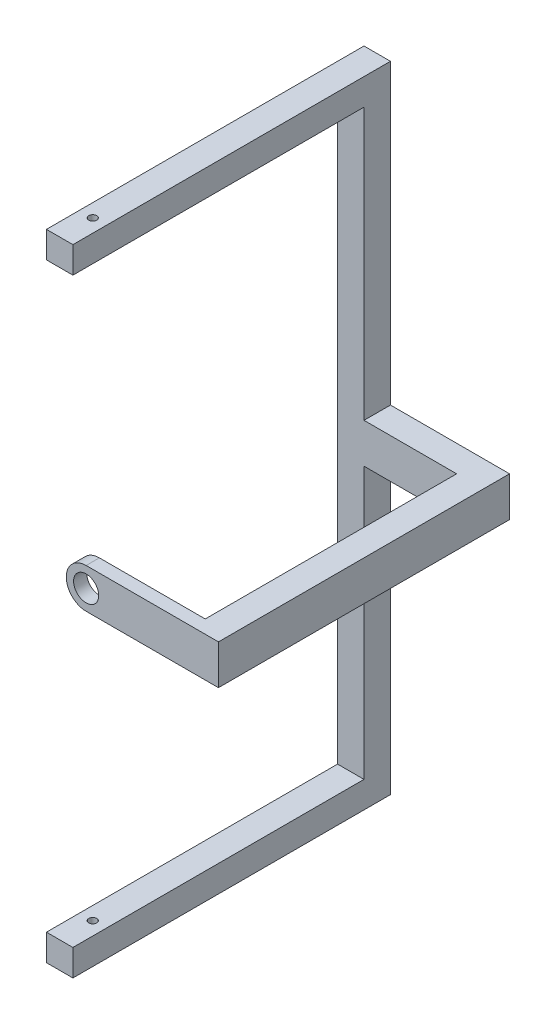
ISO-10303-21;
HEADER;
FILE_DESCRIPTION(('STEP AP214'),'2;1');
FILE_NAME('part.step','',(''),(''),'','','');
FILE_SCHEMA(('AUTOMOTIVE_DESIGN { 1 0 10303 214 1 1 1 1 }'));
ENDSEC;
DATA;
#1=APPLICATION_CONTEXT('core data for automotive mechanical design processes');
#2=APPLICATION_PROTOCOL_DEFINITION('international standard','automotive_design',2000,#1);
#3=PRODUCT_CONTEXT('',#1,'mechanical');
#4=PRODUCT('Part','Part','',(#3));
#5=PRODUCT_RELATED_PRODUCT_CATEGORY('part','',(#4));
#6=PRODUCT_DEFINITION_FORMATION('','',#4);
#7=PRODUCT_DEFINITION_CONTEXT('part definition',#1,'design');
#8=PRODUCT_DEFINITION('design','',#6,#7);
#9=PRODUCT_DEFINITION_SHAPE('','',#8);
#10=(LENGTH_UNIT() NAMED_UNIT(*) SI_UNIT(.MILLI.,.METRE.));
#11=(NAMED_UNIT(*) PLANE_ANGLE_UNIT() SI_UNIT($,.RADIAN.));
#12=(NAMED_UNIT(*) SI_UNIT($,.STERADIAN.) SOLID_ANGLE_UNIT());
#13=UNCERTAINTY_MEASURE_WITH_UNIT(LENGTH_MEASURE(1.E-05),#10,'distance_accuracy_value','');
#14=(GEOMETRIC_REPRESENTATION_CONTEXT(3) GLOBAL_UNCERTAINTY_ASSIGNED_CONTEXT((#13)) GLOBAL_UNIT_ASSIGNED_CONTEXT((#10,
#11,#12)) REPRESENTATION_CONTEXT('',''));
#15=CARTESIAN_POINT('',(0.,0.,0.));
#16=DIRECTION('',(0.,0.,1.));
#17=DIRECTION('',(1.,0.,0.));
#18=AXIS2_PLACEMENT_3D('',#15,#16,#17);
#19=CARTESIAN_POINT('',(80.,15.,-210.));
#20=DIRECTION('',(1.,0.,0.));
#21=DIRECTION('',(0.,0.,-1.));
#22=AXIS2_PLACEMENT_3D('',#19,#20,#21);
#23=PLANE('',#22);
#24=DIRECTION('',(0.,1.,0.));
#25=VECTOR('',#24,1.);
#26=CARTESIAN_POINT('',(80.,15.,-190.));
#27=LINE('',#26,#25);
#28=CARTESIAN_POINT('',(80.,-15.,-190.));
#29=VERTEX_POINT('',#28);
#30=CARTESIAN_POINT('',(80.,15.,-190.));
#31=VERTEX_POINT('',#30);
#32=EDGE_CURVE('E276',#29,#31,#27,.T.);
#33=ORIENTED_EDGE('',*,*,#32,.F.);
#34=DIRECTION('',(0.,0.,1.));
#35=VECTOR('',#34,1.);
#36=CARTESIAN_POINT('',(80.,-15.,-210.));
#37=LINE('',#36,#35);
#38=CARTESIAN_POINT('',(80.,-15.,0.));
#39=VERTEX_POINT('',#38);
#40=EDGE_CURVE('E61',#29,#39,#37,.T.);
#41=ORIENTED_EDGE('',*,*,#40,.T.);
#42=DIRECTION('',(0.,1.,0.));
#43=VECTOR('',#42,1.);
#44=CARTESIAN_POINT('',(80.,15.,0.));
#45=LINE('',#44,#43);
#46=CARTESIAN_POINT('',(80.,15.,0.));
#47=VERTEX_POINT('',#46);
#48=EDGE_CURVE('E293',#39,#47,#45,.T.);
#49=ORIENTED_EDGE('',*,*,#48,.T.);
#50=DIRECTION('',(0.,0.,1.));
#51=VECTOR('',#50,1.);
#52=CARTESIAN_POINT('',(80.,15.,-210.));
#53=LINE('',#52,#51);
#54=EDGE_CURVE('E305',#31,#47,#53,.T.);
#55=ORIENTED_EDGE('',*,*,#54,.F.);
#56=EDGE_LOOP('',(#33,#41,#49,#55));
#57=FACE_BOUND('',#56,.T.);
#58=ADVANCED_FACE('F45',(#57),#23,.F.);
#59=CARTESIAN_POINT('',(0.,0.,0.));
#60=DIRECTION('',(0.,0.,1.));
#61=DIRECTION('',(1.,0.,0.));
#62=AXIS2_PLACEMENT_3D('',#59,#60,#61);
#63=PLANE('',#62);
#64=CARTESIAN_POINT('',(0.,0.,0.));
#65=DIRECTION('',(0.,0.,1.));
#66=DIRECTION('',(1.,0.,0.));
#67=AXIS2_PLACEMENT_3D('',#64,#65,#66);
#68=CIRCLE('',#67,9.5);
#69=CARTESIAN_POINT('',(9.5,0.,0.));
#70=VERTEX_POINT('',#69);
#71=EDGE_CURVE('E312',#70,#70,#68,.T.);
#72=ORIENTED_EDGE('',*,*,#71,.T.);
#73=EDGE_LOOP('',(#72));
#74=FACE_BOUND('',#73,.T.);
#75=ORIENTED_EDGE('',*,*,#48,.F.);
#76=DIRECTION('',(1.,0.,0.));
#77=VECTOR('',#76,1.);
#78=CARTESIAN_POINT('',(100.,-15.,0.));
#79=LINE('',#78,#77);
#80=CARTESIAN_POINT('',(0.,-15.,0.));
#81=VERTEX_POINT('',#80);
#82=EDGE_CURVE('E335',#81,#39,#79,.T.);
#83=ORIENTED_EDGE('',*,*,#82,.F.);
#84=CARTESIAN_POINT('',(0.,0.,0.));
#85=DIRECTION('',(0.,0.,1.));
#86=DIRECTION('',(1.,0.,0.));
#87=AXIS2_PLACEMENT_3D('',#84,#85,#86);
#88=CIRCLE('',#87,15.);
#89=CARTESIAN_POINT('',(0.,15.,0.));
#90=VERTEX_POINT('',#89);
#91=EDGE_CURVE('E317',#90,#81,#88,.T.);
#92=ORIENTED_EDGE('',*,*,#91,.F.);
#93=DIRECTION('',(-1.,0.,0.));
#94=VECTOR('',#93,1.);
#95=CARTESIAN_POINT('',(0.,15.,0.));
#96=LINE('',#95,#94);
#97=EDGE_CURVE('E85',#47,#90,#96,.T.);
#98=ORIENTED_EDGE('',*,*,#97,.F.);
#99=EDGE_LOOP('',(#75,#83,#92,#98));
#100=FACE_BOUND('',#99,.T.);
#101=ADVANCED_FACE('F368',(#74,#100),#63,.F.);
#102=CARTESIAN_POINT('',(0.,0.,10.));
#103=DIRECTION('',(0.,0.,1.));
#104=DIRECTION('',(1.,0.,0.));
#105=AXIS2_PLACEMENT_3D('',#102,#103,#104);
#106=PLANE('',#105);
#107=CARTESIAN_POINT('',(0.,0.,10.));
#108=DIRECTION('',(0.,0.,1.));
#109=DIRECTION('',(1.,0.,0.));
#110=AXIS2_PLACEMENT_3D('',#107,#108,#109);
#111=CIRCLE('',#110,15.);
#112=CARTESIAN_POINT('',(0.,15.,10.));
#113=VERTEX_POINT('',#112);
#114=CARTESIAN_POINT('',(0.,-15.,10.));
#115=VERTEX_POINT('',#114);
#116=EDGE_CURVE('E321',#113,#115,#111,.T.);
#117=ORIENTED_EDGE('',*,*,#116,.T.);
#118=DIRECTION('',(1.,0.,0.));
#119=VECTOR('',#118,1.);
#120=CARTESIAN_POINT('',(100.,-15.,10.));
#121=LINE('',#120,#119);
#122=CARTESIAN_POINT('',(100.,-15.,10.));
#123=VERTEX_POINT('',#122);
#124=EDGE_CURVE('E92',#115,#123,#121,.T.);
#125=ORIENTED_EDGE('',*,*,#124,.T.);
#126=DIRECTION('',(0.,1.,0.));
#127=VECTOR('',#126,1.);
#128=CARTESIAN_POINT('',(100.,15.,10.));
#129=LINE('',#128,#127);
#130=CARTESIAN_POINT('',(100.,15.,10.));
#131=VERTEX_POINT('',#130);
#132=EDGE_CURVE('E326',#123,#131,#129,.T.);
#133=ORIENTED_EDGE('',*,*,#132,.T.);
#134=DIRECTION('',(-1.,0.,0.));
#135=VECTOR('',#134,1.);
#136=CARTESIAN_POINT('',(0.,15.,10.));
#137=LINE('',#136,#135);
#138=EDGE_CURVE('E70',#131,#113,#137,.T.);
#139=ORIENTED_EDGE('',*,*,#138,.T.);
#140=EDGE_LOOP('',(#117,#125,#133,#139));
#141=FACE_BOUND('',#140,.T.);
#142=CARTESIAN_POINT('',(0.,0.,10.));
#143=DIRECTION('',(0.,0.,1.));
#144=DIRECTION('',(1.,0.,0.));
#145=AXIS2_PLACEMENT_3D('',#142,#143,#144);
#146=CIRCLE('',#145,9.5);
#147=CARTESIAN_POINT('',(9.5,0.,10.));
#148=VERTEX_POINT('',#147);
#149=EDGE_CURVE('E313',#148,#148,#146,.T.);
#150=ORIENTED_EDGE('',*,*,#149,.F.);
#151=EDGE_LOOP('',(#150));
#152=FACE_BOUND('',#151,.T.);
#153=ADVANCED_FACE('F365',(#141,#152),#106,.T.);
#154=CARTESIAN_POINT('',(0.,0.,10.));
#155=DIRECTION('',(0.,0.,-1.));
#156=DIRECTION('',(-1.,0.,0.));
#157=AXIS2_PLACEMENT_3D('',#154,#155,#156);
#158=CYLINDRICAL_SURFACE('',#157,15.);
#159=ORIENTED_EDGE('',*,*,#91,.T.);
#160=DIRECTION('',(0.,0.,-1.));
#161=VECTOR('',#160,1.);
#162=CARTESIAN_POINT('',(0.,-15.,10.));
#163=LINE('',#162,#161);
#164=EDGE_CURVE('E11',#115,#81,#163,.T.);
#165=ORIENTED_EDGE('',*,*,#164,.F.);
#166=ORIENTED_EDGE('',*,*,#116,.F.);
#167=DIRECTION('',(0.,0.,-1.));
#168=VECTOR('',#167,1.);
#169=CARTESIAN_POINT('',(0.,15.,10.));
#170=LINE('',#169,#168);
#171=EDGE_CURVE('E331',#113,#90,#170,.T.);
#172=ORIENTED_EDGE('',*,*,#171,.T.);
#173=EDGE_LOOP('',(#159,#165,#166,#172));
#174=FACE_BOUND('',#173,.T.);
#175=ADVANCED_FACE('F47',(#174),#158,.T.);
#176=CARTESIAN_POINT('',(100.,-15.,10.));
#177=DIRECTION('',(0.,1.,0.));
#178=DIRECTION('',(-1.,0.,0.));
#179=AXIS2_PLACEMENT_3D('',#176,#177,#178);
#180=PLANE('',#179);
#181=ORIENTED_EDGE('',*,*,#82,.T.);
#182=ORIENTED_EDGE('',*,*,#40,.F.);
#183=DIRECTION('',(1.,0.,0.));
#184=VECTOR('',#183,1.);
#185=CARTESIAN_POINT('',(9.99999999999999,-15.,-190.));
#186=LINE('',#185,#184);
#187=CARTESIAN_POINT('',(9.99999999999999,-15.,-190.));
#188=VERTEX_POINT('',#187);
#189=EDGE_CURVE('E290',#188,#29,#186,.T.);
#190=ORIENTED_EDGE('',*,*,#189,.F.);
#191=DIRECTION('',(0.,0.,1.));
#192=VECTOR('',#191,1.);
#193=CARTESIAN_POINT('',(9.99999999999999,-15.,-210.));
#194=LINE('',#193,#192);
#195=CARTESIAN_POINT('',(9.99999999999999,-15.,-210.));
#196=VERTEX_POINT('',#195);
#197=EDGE_CURVE('E277',#196,#188,#194,.T.);
#198=ORIENTED_EDGE('',*,*,#197,.F.);
#199=DIRECTION('',(-1.,0.,0.));
#200=VECTOR('',#199,1.);
#201=CARTESIAN_POINT('',(100.,-15.,-210.));
#202=LINE('',#201,#200);
#203=CARTESIAN_POINT('',(100.,-15.,-210.));
#204=VERTEX_POINT('',#203);
#205=EDGE_CURVE('E298',#204,#196,#202,.T.);
#206=ORIENTED_EDGE('',*,*,#205,.F.);
#207=DIRECTION('',(0.,0.,-1.));
#208=VECTOR('',#207,1.);
#209=CARTESIAN_POINT('',(100.,-15.,10.));
#210=LINE('',#209,#208);
#211=EDGE_CURVE('E54',#123,#204,#210,.T.);
#212=ORIENTED_EDGE('',*,*,#211,.F.);
#213=ORIENTED_EDGE('',*,*,#124,.F.);
#214=ORIENTED_EDGE('',*,*,#164,.T.);
#215=EDGE_LOOP('',(#181,#182,#190,#198,#206,#212,#213,#214));
#216=FACE_BOUND('',#215,.T.);
#217=ADVANCED_FACE('F353',(#216),#180,.F.);
#218=CARTESIAN_POINT('',(100.,15.,10.));
#219=DIRECTION('',(-1.,0.,0.));
#220=DIRECTION('',(0.,0.,1.));
#221=AXIS2_PLACEMENT_3D('',#218,#219,#220);
#222=PLANE('',#221);
#223=ORIENTED_EDGE('',*,*,#211,.T.);
#224=DIRECTION('',(0.,-1.,0.));
#225=VECTOR('',#224,1.);
#226=CARTESIAN_POINT('',(100.,15.,-210.));
#227=LINE('',#226,#225);
#228=CARTESIAN_POINT('',(100.,15.,-210.));
#229=VERTEX_POINT('',#228);
#230=EDGE_CURVE('E294',#229,#204,#227,.T.);
#231=ORIENTED_EDGE('',*,*,#230,.F.);
#232=DIRECTION('',(0.,0.,-1.));
#233=VECTOR('',#232,1.);
#234=CARTESIAN_POINT('',(100.,15.,10.));
#235=LINE('',#234,#233);
#236=EDGE_CURVE('E343',#131,#229,#235,.T.);
#237=ORIENTED_EDGE('',*,*,#236,.F.);
#238=ORIENTED_EDGE('',*,*,#132,.F.);
#239=EDGE_LOOP('',(#223,#231,#237,#238));
#240=FACE_BOUND('',#239,.T.);
#241=ADVANCED_FACE('F350',(#240),#222,.F.);
#242=CARTESIAN_POINT('',(0.,15.,10.));
#243=DIRECTION('',(0.,-1.,0.));
#244=DIRECTION('',(1.,0.,0.));
#245=AXIS2_PLACEMENT_3D('',#242,#243,#244);
#246=PLANE('',#245);
#247=ORIENTED_EDGE('',*,*,#236,.T.);
#248=DIRECTION('',(1.,0.,0.));
#249=VECTOR('',#248,1.);
#250=CARTESIAN_POINT('',(100.,15.,-210.));
#251=LINE('',#250,#249);
#252=CARTESIAN_POINT('',(9.99999999999999,15.,-210.));
#253=VERTEX_POINT('',#252);
#254=EDGE_CURVE('E301',#253,#229,#251,.T.);
#255=ORIENTED_EDGE('',*,*,#254,.F.);
#256=DIRECTION('',(0.,0.,-1.));
#257=VECTOR('',#256,1.);
#258=CARTESIAN_POINT('',(9.99999999999999,15.,-210.));
#259=LINE('',#258,#257);
#260=CARTESIAN_POINT('',(9.99999999999999,15.,-190.));
#261=VERTEX_POINT('',#260);
#262=EDGE_CURVE('E281',#261,#253,#259,.T.);
#263=ORIENTED_EDGE('',*,*,#262,.F.);
#264=DIRECTION('',(1.,0.,0.));
#265=VECTOR('',#264,1.);
#266=CARTESIAN_POINT('',(9.99999999999999,15.,-190.));
#267=LINE('',#266,#265);
#268=EDGE_CURVE('E284',#261,#31,#267,.T.);
#269=ORIENTED_EDGE('',*,*,#268,.T.);
#270=ORIENTED_EDGE('',*,*,#54,.T.);
#271=ORIENTED_EDGE('',*,*,#97,.T.);
#272=ORIENTED_EDGE('',*,*,#171,.F.);
#273=ORIENTED_EDGE('',*,*,#138,.F.);
#274=EDGE_LOOP('',(#247,#255,#263,#269,#270,#271,#272,#273));
#275=FACE_BOUND('',#274,.T.);
#276=ADVANCED_FACE('F360',(#275),#246,.F.);
#277=CARTESIAN_POINT('',(0.,0.,10.));
#278=DIRECTION('',(0.,0.,-1.));
#279=DIRECTION('',(-1.,0.,0.));
#280=AXIS2_PLACEMENT_3D('',#277,#278,#279);
#281=CYLINDRICAL_SURFACE('',#280,9.5);
#282=ORIENTED_EDGE('',*,*,#149,.T.);
#283=EDGE_LOOP('',(#282));
#284=FACE_BOUND('',#283,.T.);
#285=ORIENTED_EDGE('',*,*,#71,.F.);
#286=EDGE_LOOP('',(#285));
#287=FACE_BOUND('',#286,.T.);
#288=ADVANCED_FACE('F372',(#284,#287),#281,.F.);
#289=CARTESIAN_POINT('',(0.,0.,-210.));
#290=DIRECTION('',(0.,0.,-1.));
#291=DIRECTION('',(-1.,0.,0.));
#292=AXIS2_PLACEMENT_3D('',#289,#290,#291);
#293=PLANE('',#292);
#294=ORIENTED_EDGE('',*,*,#230,.T.);
#295=ORIENTED_EDGE('',*,*,#205,.T.);
#296=DIRECTION('',(0.,-1.,0.));
#297=VECTOR('',#296,1.);
#298=CARTESIAN_POINT('',(9.99999999999999,-240.,-210.));
#299=LINE('',#298,#297);
#300=CARTESIAN_POINT('',(9.99999999999999,-240.,-210.));
#301=VERTEX_POINT('',#300);
#302=EDGE_CURVE('E193',#196,#301,#299,.T.);
#303=ORIENTED_EDGE('',*,*,#302,.T.);
#304=DIRECTION('',(1.,0.,0.));
#305=VECTOR('',#304,1.);
#306=CARTESIAN_POINT('',(-10.,-240.,-210.));
#307=LINE('',#306,#305);
#308=CARTESIAN_POINT('',(-10.,-240.,-210.));
#309=VERTEX_POINT('',#308);
#310=EDGE_CURVE('E272',#309,#301,#307,.T.);
#311=ORIENTED_EDGE('',*,*,#310,.F.);
#312=DIRECTION('',(0.,-1.,0.));
#313=VECTOR('',#312,1.);
#314=CARTESIAN_POINT('',(-10.,-240.,-210.));
#315=LINE('',#314,#313);
#316=CARTESIAN_POINT('',(-10.,240.,-210.));
#317=VERTEX_POINT('',#316);
#318=EDGE_CURVE('E236',#317,#309,#315,.T.);
#319=ORIENTED_EDGE('',*,*,#318,.F.);
#320=DIRECTION('',(1.,0.,0.));
#321=VECTOR('',#320,1.);
#322=CARTESIAN_POINT('',(-10.,240.,-210.));
#323=LINE('',#322,#321);
#324=CARTESIAN_POINT('',(9.99999999999999,240.,-210.));
#325=VERTEX_POINT('',#324);
#326=EDGE_CURVE('E214',#317,#325,#323,.T.);
#327=ORIENTED_EDGE('',*,*,#326,.T.);
#328=DIRECTION('',(0.,1.,0.));
#329=VECTOR('',#328,1.);
#330=CARTESIAN_POINT('',(9.99999999999999,240.,-210.));
#331=LINE('',#330,#329);
#332=EDGE_CURVE('E199',#253,#325,#331,.T.);
#333=ORIENTED_EDGE('',*,*,#332,.F.);
#334=ORIENTED_EDGE('',*,*,#254,.T.);
#335=EDGE_LOOP('',(#294,#295,#303,#311,#319,#327,#333,#334));
#336=FACE_BOUND('',#335,.T.);
#337=ADVANCED_FACE('F356',(#336),#293,.T.);
#338=CARTESIAN_POINT('',(9.99999999999999,15.,-190.));
#339=DIRECTION('',(0.,0.,-1.));
#340=DIRECTION('',(-1.,0.,0.));
#341=AXIS2_PLACEMENT_3D('',#338,#339,#340);
#342=PLANE('',#341);
#343=ORIENTED_EDGE('',*,*,#268,.F.);
#344=DIRECTION('',(0.,-1.,0.));
#345=VECTOR('',#344,1.);
#346=CARTESIAN_POINT('',(9.99999999999999,0.,-190.));
#347=LINE('',#346,#345);
#348=CARTESIAN_POINT('',(9.99999999999999,220.,-190.));
#349=VERTEX_POINT('',#348);
#350=EDGE_CURVE('E188',#349,#261,#347,.T.);
#351=ORIENTED_EDGE('',*,*,#350,.F.);
#352=DIRECTION('',(1.,0.,0.));
#353=VECTOR('',#352,1.);
#354=CARTESIAN_POINT('',(-10.,220.,-190.));
#355=LINE('',#354,#353);
#356=CARTESIAN_POINT('',(-10.,220.,-190.));
#357=VERTEX_POINT('',#356);
#358=EDGE_CURVE('E185',#357,#349,#355,.T.);
#359=ORIENTED_EDGE('',*,*,#358,.F.);
#360=DIRECTION('',(0.,1.,0.));
#361=VECTOR('',#360,1.);
#362=CARTESIAN_POINT('',(-10.,0.,-190.));
#363=LINE('',#362,#361);
#364=CARTESIAN_POINT('',(-10.,-220.,-190.));
#365=VERTEX_POINT('',#364);
#366=EDGE_CURVE('E169',#365,#357,#363,.T.);
#367=ORIENTED_EDGE('',*,*,#366,.F.);
#368=DIRECTION('',(1.,0.,0.));
#369=VECTOR('',#368,1.);
#370=CARTESIAN_POINT('',(-10.,-220.,-190.));
#371=LINE('',#370,#369);
#372=CARTESIAN_POINT('',(9.99999999999999,-220.,-190.));
#373=VERTEX_POINT('',#372);
#374=EDGE_CURVE('E182',#365,#373,#371,.T.);
#375=ORIENTED_EDGE('',*,*,#374,.T.);
#376=DIRECTION('',(0.,1.,0.));
#377=VECTOR('',#376,1.);
#378=CARTESIAN_POINT('',(9.99999999999999,0.,-190.));
#379=LINE('',#378,#377);
#380=EDGE_CURVE('E240',#373,#188,#379,.T.);
#381=ORIENTED_EDGE('',*,*,#380,.T.);
#382=ORIENTED_EDGE('',*,*,#189,.T.);
#383=ORIENTED_EDGE('',*,*,#32,.T.);
#384=EDGE_LOOP('',(#343,#351,#359,#367,#375,#381,#382,#383));
#385=FACE_BOUND('',#384,.T.);
#386=ADVANCED_FACE('F187',(#385),#342,.F.);
#387=CARTESIAN_POINT('',(9.99999999999999,0.,0.));
#388=DIRECTION('',(1.,0.,0.));
#389=DIRECTION('',(0.,0.,-1.));
#390=AXIS2_PLACEMENT_3D('',#387,#388,#389);
#391=PLANE('',#390);
#392=ORIENTED_EDGE('',*,*,#197,.T.);
#393=ORIENTED_EDGE('',*,*,#380,.F.);
#394=DIRECTION('',(0.,0.,-1.));
#395=VECTOR('',#394,1.);
#396=CARTESIAN_POINT('',(9.99999999999999,-220.,-190.));
#397=LINE('',#396,#395);
#398=CARTESIAN_POINT('',(9.99999999999999,-220.,29.9999999999999));
#399=VERTEX_POINT('',#398);
#400=EDGE_CURVE('E256',#399,#373,#397,.T.);
#401=ORIENTED_EDGE('',*,*,#400,.F.);
#402=DIRECTION('',(0.,1.,0.));
#403=VECTOR('',#402,1.);
#404=CARTESIAN_POINT('',(9.99999999999999,-220.,29.9999999999999));
#405=LINE('',#404,#403);
#406=CARTESIAN_POINT('',(9.99999999999999,-240.,29.9999999999999));
#407=VERTEX_POINT('',#406);
#408=EDGE_CURVE('E253',#407,#399,#405,.T.);
#409=ORIENTED_EDGE('',*,*,#408,.F.);
#410=DIRECTION('',(0.,0.,1.));
#411=VECTOR('',#410,1.);
#412=CARTESIAN_POINT('',(9.99999999999999,-240.,29.9999999999999));
#413=LINE('',#412,#411);
#414=EDGE_CURVE('E250',#301,#407,#413,.T.);
#415=ORIENTED_EDGE('',*,*,#414,.F.);
#416=ORIENTED_EDGE('',*,*,#302,.F.);
#417=EDGE_LOOP('',(#392,#393,#401,#409,#415,#416));
#418=FACE_BOUND('',#417,.T.);
#419=ADVANCED_FACE('F384',(#418),#391,.T.);
#420=CARTESIAN_POINT('',(-10.,-240.,29.9999999999999));
#421=DIRECTION('',(0.,1.,0.));
#422=DIRECTION('',(0.,0.,1.));
#423=AXIS2_PLACEMENT_3D('',#420,#421,#422);
#424=PLANE('',#423);
#425=CARTESIAN_POINT('',(0.,-240.,5.));
#426=DIRECTION('',(0.,1.,0.));
#427=DIRECTION('',(0.,0.,1.));
#428=AXIS2_PLACEMENT_3D('',#425,#426,#427);
#429=CIRCLE('',#428,3.);
#430=CARTESIAN_POINT('',(0.,-240.,8.));
#431=VERTEX_POINT('',#430);
#432=EDGE_CURVE('E218',#431,#431,#429,.T.);
#433=ORIENTED_EDGE('',*,*,#432,.T.);
#434=EDGE_LOOP('',(#433));
#435=FACE_BOUND('',#434,.T.);
#436=ORIENTED_EDGE('',*,*,#414,.T.);
#437=DIRECTION('',(1.,0.,0.));
#438=VECTOR('',#437,1.);
#439=CARTESIAN_POINT('',(-10.,-240.,29.9999999999999));
#440=LINE('',#439,#438);
#441=CARTESIAN_POINT('',(-10.,-240.,29.9999999999999));
#442=VERTEX_POINT('',#441);
#443=EDGE_CURVE('E268',#442,#407,#440,.T.);
#444=ORIENTED_EDGE('',*,*,#443,.F.);
#445=DIRECTION('',(0.,0.,1.));
#446=VECTOR('',#445,1.);
#447=CARTESIAN_POINT('',(-10.,-240.,29.9999999999999));
#448=LINE('',#447,#446);
#449=EDGE_CURVE('E239',#309,#442,#448,.T.);
#450=ORIENTED_EDGE('',*,*,#449,.F.);
#451=ORIENTED_EDGE('',*,*,#310,.T.);
#452=EDGE_LOOP('',(#436,#444,#450,#451));
#453=FACE_BOUND('',#452,.T.);
#454=ADVANCED_FACE('F397',(#435,#453),#424,.F.);
#455=CARTESIAN_POINT('',(-10.,-220.,29.9999999999999));
#456=DIRECTION('',(0.,0.,-1.));
#457=DIRECTION('',(-1.,0.,0.));
#458=AXIS2_PLACEMENT_3D('',#455,#456,#457);
#459=PLANE('',#458);
#460=ORIENTED_EDGE('',*,*,#408,.T.);
#461=DIRECTION('',(1.,0.,0.));
#462=VECTOR('',#461,1.);
#463=CARTESIAN_POINT('',(-10.,-220.,29.9999999999999));
#464=LINE('',#463,#462);
#465=CARTESIAN_POINT('',(-10.,-220.,29.9999999999999));
#466=VERTEX_POINT('',#465);
#467=EDGE_CURVE('E264',#466,#399,#464,.T.);
#468=ORIENTED_EDGE('',*,*,#467,.F.);
#469=DIRECTION('',(0.,1.,0.));
#470=VECTOR('',#469,1.);
#471=CARTESIAN_POINT('',(-10.,-220.,29.9999999999999));
#472=LINE('',#471,#470);
#473=EDGE_CURVE('E243',#442,#466,#472,.T.);
#474=ORIENTED_EDGE('',*,*,#473,.F.);
#475=ORIENTED_EDGE('',*,*,#443,.T.);
#476=EDGE_LOOP('',(#460,#468,#474,#475));
#477=FACE_BOUND('',#476,.T.);
#478=ADVANCED_FACE('F392',(#477),#459,.F.);
#479=CARTESIAN_POINT('',(-10.,-220.,-190.));
#480=DIRECTION('',(0.,-1.,0.));
#481=DIRECTION('',(0.,0.,-1.));
#482=AXIS2_PLACEMENT_3D('',#479,#480,#481);
#483=PLANE('',#482);
#484=CARTESIAN_POINT('',(0.,-220.,5.));
#485=DIRECTION('',(0.,1.,0.));
#486=DIRECTION('',(0.,0.,1.));
#487=AXIS2_PLACEMENT_3D('',#484,#485,#486);
#488=CIRCLE('',#487,3.);
#489=CARTESIAN_POINT('',(0.,-220.,8.));
#490=VERTEX_POINT('',#489);
#491=EDGE_CURVE('E208',#490,#490,#488,.T.);
#492=ORIENTED_EDGE('',*,*,#491,.F.);
#493=EDGE_LOOP('',(#492));
#494=FACE_BOUND('',#493,.T.);
#495=ORIENTED_EDGE('',*,*,#400,.T.);
#496=ORIENTED_EDGE('',*,*,#374,.F.);
#497=DIRECTION('',(0.,0.,-1.));
#498=VECTOR('',#497,1.);
#499=CARTESIAN_POINT('',(-10.,-220.,-190.));
#500=LINE('',#499,#498);
#501=EDGE_CURVE('E177',#466,#365,#500,.T.);
#502=ORIENTED_EDGE('',*,*,#501,.F.);
#503=ORIENTED_EDGE('',*,*,#467,.T.);
#504=EDGE_LOOP('',(#495,#496,#502,#503));
#505=FACE_BOUND('',#504,.T.);
#506=ADVANCED_FACE('F388',(#494,#505),#483,.F.);
#507=CARTESIAN_POINT('',(-10.,0.,0.));
#508=DIRECTION('',(1.,0.,0.));
#509=DIRECTION('',(0.,0.,-1.));
#510=AXIS2_PLACEMENT_3D('',#507,#508,#509);
#511=PLANE('',#510);
#512=ORIENTED_EDGE('',*,*,#366,.T.);
#513=DIRECTION('',(0.,0.,-1.));
#514=VECTOR('',#513,1.);
#515=CARTESIAN_POINT('',(-10.,220.,-190.));
#516=LINE('',#515,#514);
#517=CARTESIAN_POINT('',(-10.,220.,29.9999999999999));
#518=VERTEX_POINT('',#517);
#519=EDGE_CURVE('E174',#518,#357,#516,.T.);
#520=ORIENTED_EDGE('',*,*,#519,.F.);
#521=DIRECTION('',(0.,-1.,0.));
#522=VECTOR('',#521,1.);
#523=CARTESIAN_POINT('',(-10.,220.,29.9999999999999));
#524=LINE('',#523,#522);
#525=CARTESIAN_POINT('',(-10.,240.,29.9999999999999));
#526=VERTEX_POINT('',#525);
#527=EDGE_CURVE('E198',#526,#518,#524,.T.);
#528=ORIENTED_EDGE('',*,*,#527,.F.);
#529=DIRECTION('',(0.,0.,1.));
#530=VECTOR('',#529,1.);
#531=CARTESIAN_POINT('',(-10.,240.,29.9999999999999));
#532=LINE('',#531,#530);
#533=EDGE_CURVE('E203',#317,#526,#532,.T.);
#534=ORIENTED_EDGE('',*,*,#533,.F.);
#535=ORIENTED_EDGE('',*,*,#318,.T.);
#536=ORIENTED_EDGE('',*,*,#449,.T.);
#537=ORIENTED_EDGE('',*,*,#473,.T.);
#538=ORIENTED_EDGE('',*,*,#501,.T.);
#539=EDGE_LOOP('',(#512,#520,#528,#534,#535,#536,#537,#538));
#540=FACE_BOUND('',#539,.T.);
#541=ADVANCED_FACE('F171',(#540),#511,.F.);
#542=CARTESIAN_POINT('',(9.99999999999999,0.,0.));
#543=DIRECTION('',(1.,0.,0.));
#544=DIRECTION('',(0.,0.,-1.));
#545=AXIS2_PLACEMENT_3D('',#542,#543,#544);
#546=PLANE('',#545);
#547=ORIENTED_EDGE('',*,*,#262,.T.);
#548=ORIENTED_EDGE('',*,*,#332,.T.);
#549=DIRECTION('',(0.,0.,1.));
#550=VECTOR('',#549,1.);
#551=CARTESIAN_POINT('',(9.99999999999999,240.,29.9999999999999));
#552=LINE('',#551,#550);
#553=CARTESIAN_POINT('',(9.99999999999999,240.,29.9999999999999));
#554=VERTEX_POINT('',#553);
#555=EDGE_CURVE('E205',#325,#554,#552,.T.);
#556=ORIENTED_EDGE('',*,*,#555,.T.);
#557=DIRECTION('',(0.,-1.,0.));
#558=VECTOR('',#557,1.);
#559=CARTESIAN_POINT('',(9.99999999999999,220.,29.9999999999999));
#560=LINE('',#559,#558);
#561=CARTESIAN_POINT('',(9.99999999999999,220.,29.9999999999999));
#562=VERTEX_POINT('',#561);
#563=EDGE_CURVE('E221',#554,#562,#560,.T.);
#564=ORIENTED_EDGE('',*,*,#563,.T.);
#565=DIRECTION('',(0.,0.,-1.));
#566=VECTOR('',#565,1.);
#567=CARTESIAN_POINT('',(9.99999999999999,220.,-190.));
#568=LINE('',#567,#566);
#569=EDGE_CURVE('E217',#562,#349,#568,.T.);
#570=ORIENTED_EDGE('',*,*,#569,.T.);
#571=ORIENTED_EDGE('',*,*,#350,.T.);
#572=EDGE_LOOP('',(#547,#548,#556,#564,#570,#571));
#573=FACE_BOUND('',#572,.T.);
#574=ADVANCED_FACE('F408',(#573),#546,.T.);
#575=CARTESIAN_POINT('',(-10.,220.,-190.));
#576=DIRECTION('',(0.,-1.,0.));
#577=DIRECTION('',(0.,0.,-1.));
#578=AXIS2_PLACEMENT_3D('',#575,#576,#577);
#579=PLANE('',#578);
#580=CARTESIAN_POINT('',(0.,220.,5.));
#581=DIRECTION('',(0.,1.,0.));
#582=DIRECTION('',(0.,0.,1.));
#583=AXIS2_PLACEMENT_3D('',#580,#581,#582);
#584=CIRCLE('',#583,3.);
#585=CARTESIAN_POINT('',(0.,220.,8.));
#586=VERTEX_POINT('',#585);
#587=EDGE_CURVE('E602',#586,#586,#584,.T.);
#588=ORIENTED_EDGE('',*,*,#587,.T.);
#589=EDGE_LOOP('',(#588));
#590=FACE_BOUND('',#589,.T.);
#591=ORIENTED_EDGE('',*,*,#569,.F.);
#592=DIRECTION('',(1.,0.,0.));
#593=VECTOR('',#592,1.);
#594=CARTESIAN_POINT('',(-10.,220.,29.9999999999999));
#595=LINE('',#594,#593);
#596=EDGE_CURVE('E194',#518,#562,#595,.T.);
#597=ORIENTED_EDGE('',*,*,#596,.F.);
#598=ORIENTED_EDGE('',*,*,#519,.T.);
#599=ORIENTED_EDGE('',*,*,#358,.T.);
#600=EDGE_LOOP('',(#591,#597,#598,#599));
#601=FACE_BOUND('',#600,.T.);
#602=ADVANCED_FACE('F196',(#590,#601),#579,.T.);
#603=CARTESIAN_POINT('',(-10.,220.,29.9999999999999));
#604=DIRECTION('',(0.,0.,1.));
#605=DIRECTION('',(1.,0.,0.));
#606=AXIS2_PLACEMENT_3D('',#603,#604,#605);
#607=PLANE('',#606);
#608=ORIENTED_EDGE('',*,*,#563,.F.);
#609=DIRECTION('',(1.,0.,0.));
#610=VECTOR('',#609,1.);
#611=CARTESIAN_POINT('',(-10.,240.,29.9999999999999));
#612=LINE('',#611,#610);
#613=EDGE_CURVE('E231',#526,#554,#612,.T.);
#614=ORIENTED_EDGE('',*,*,#613,.F.);
#615=ORIENTED_EDGE('',*,*,#527,.T.);
#616=ORIENTED_EDGE('',*,*,#596,.T.);
#617=EDGE_LOOP('',(#608,#614,#615,#616));
#618=FACE_BOUND('',#617,.T.);
#619=ADVANCED_FACE('F406',(#618),#607,.T.);
#620=CARTESIAN_POINT('',(-10.,240.,29.9999999999999));
#621=DIRECTION('',(0.,1.,0.));
#622=DIRECTION('',(0.,0.,1.));
#623=AXIS2_PLACEMENT_3D('',#620,#621,#622);
#624=PLANE('',#623);
#625=CARTESIAN_POINT('',(0.,240.,5.));
#626=DIRECTION('',(0.,1.,0.));
#627=DIRECTION('',(0.,0.,1.));
#628=AXIS2_PLACEMENT_3D('',#625,#626,#627);
#629=CIRCLE('',#628,3.);
#630=CARTESIAN_POINT('',(0.,240.,8.));
#631=VERTEX_POINT('',#630);
#632=EDGE_CURVE('E599',#631,#631,#629,.T.);
#633=ORIENTED_EDGE('',*,*,#632,.F.);
#634=EDGE_LOOP('',(#633));
#635=FACE_BOUND('',#634,.T.);
#636=ORIENTED_EDGE('',*,*,#555,.F.);
#637=ORIENTED_EDGE('',*,*,#326,.F.);
#638=ORIENTED_EDGE('',*,*,#533,.T.);
#639=ORIENTED_EDGE('',*,*,#613,.T.);
#640=EDGE_LOOP('',(#636,#637,#638,#639));
#641=FACE_BOUND('',#640,.T.);
#642=ADVANCED_FACE('F403',(#635,#641),#624,.T.);
#643=CARTESIAN_POINT('',(0.,-240.,5.));
#644=DIRECTION('',(0.,1.,0.));
#645=DIRECTION('',(0.,0.,1.));
#646=AXIS2_PLACEMENT_3D('',#643,#644,#645);
#647=CYLINDRICAL_SURFACE('',#646,3.);
#648=ORIENTED_EDGE('',*,*,#432,.F.);
#649=EDGE_LOOP('',(#648));
#650=FACE_BOUND('',#649,.T.);
#651=ORIENTED_EDGE('',*,*,#491,.T.);
#652=EDGE_LOOP('',(#651));
#653=FACE_BOUND('',#652,.T.);
#654=ADVANCED_FACE('F550',(#650,#653),#647,.F.);
#655=CARTESIAN_POINT('',(0.,240.,5.));
#656=DIRECTION('',(0.,-1.,0.));
#657=DIRECTION('',(0.,0.,-1.));
#658=AXIS2_PLACEMENT_3D('',#655,#656,#657);
#659=CYLINDRICAL_SURFACE('',#658,3.);
#660=ORIENTED_EDGE('',*,*,#632,.T.);
#661=EDGE_LOOP('',(#660));
#662=FACE_BOUND('',#661,.T.);
#663=ORIENTED_EDGE('',*,*,#587,.F.);
#664=EDGE_LOOP('',(#663));
#665=FACE_BOUND('',#664,.T.);
#666=ADVANCED_FACE('F559',(#662,#665),#659,.F.);
#667=CLOSED_SHELL('',(#58,#101,#153,#175,#217,#241,#276,#288,#337,#386,#419,#454,#478,#506,#541,
#574,#602,#619,#642,#654,#666));
#668=MANIFOLD_SOLID_BREP('B2',#667);
#669=ADVANCED_BREP_SHAPE_REPRESENTATION('',(#18,#668),#14);
#670=SHAPE_DEFINITION_REPRESENTATION(#9,#669);
ENDSEC;
END-ISO-10303-21;
